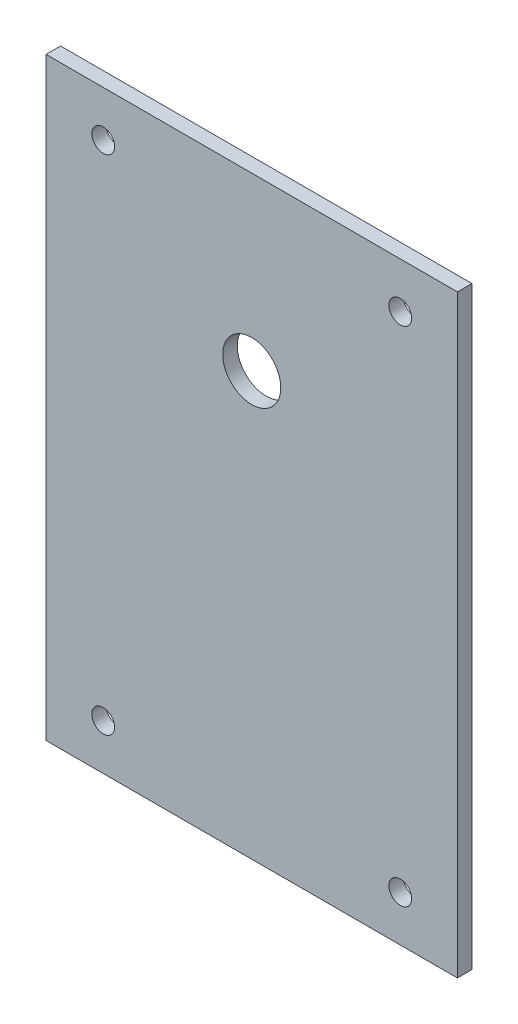
ISO-10303-21;
HEADER;
FILE_DESCRIPTION(('STEP AP214'),'2;1');
FILE_NAME('part.step','',(''),(''),'','','');
FILE_SCHEMA(('AUTOMOTIVE_DESIGN { 1 0 10303 214 1 1 1 1 }'));
ENDSEC;
DATA;
#1=APPLICATION_CONTEXT('core data for automotive mechanical design processes');
#2=APPLICATION_PROTOCOL_DEFINITION('international standard','automotive_design',2000,#1);
#3=PRODUCT_CONTEXT('',#1,'mechanical');
#4=PRODUCT('Part','Part','',(#3));
#5=PRODUCT_RELATED_PRODUCT_CATEGORY('part','',(#4));
#6=PRODUCT_DEFINITION_FORMATION('','',#4);
#7=PRODUCT_DEFINITION_CONTEXT('part definition',#1,'design');
#8=PRODUCT_DEFINITION('design','',#6,#7);
#9=PRODUCT_DEFINITION_SHAPE('','',#8);
#10=(LENGTH_UNIT() NAMED_UNIT(*) SI_UNIT(.MILLI.,.METRE.));
#11=(NAMED_UNIT(*) PLANE_ANGLE_UNIT() SI_UNIT($,.RADIAN.));
#12=(NAMED_UNIT(*) SI_UNIT($,.STERADIAN.) SOLID_ANGLE_UNIT());
#13=UNCERTAINTY_MEASURE_WITH_UNIT(LENGTH_MEASURE(1.E-05),#10,'distance_accuracy_value','');
#14=(GEOMETRIC_REPRESENTATION_CONTEXT(3) GLOBAL_UNCERTAINTY_ASSIGNED_CONTEXT((#13)) GLOBAL_UNIT_ASSIGNED_CONTEXT((#10,
#11,#12)) REPRESENTATION_CONTEXT('',''));
#15=CARTESIAN_POINT('',(0.,0.,0.));
#16=DIRECTION('',(0.,0.,1.));
#17=DIRECTION('',(1.,0.,0.));
#18=AXIS2_PLACEMENT_3D('',#15,#16,#17);
#19=CARTESIAN_POINT('',(-90.,130.,3.175));
#20=DIRECTION('',(1.,0.,0.));
#21=DIRECTION('',(0.,1.,0.));
#22=AXIS2_PLACEMENT_3D('',#19,#20,#21);
#23=PLANE('',#22);
#24=DIRECTION('',(0.,-1.,0.));
#25=VECTOR('',#24,1.);
#26=CARTESIAN_POINT('',(-90.,130.,0.));
#27=LINE('',#26,#25);
#28=CARTESIAN_POINT('',(-90.,130.,0.));
#29=VERTEX_POINT('',#28);
#30=CARTESIAN_POINT('',(-90.,0.,0.));
#31=VERTEX_POINT('',#30);
#32=EDGE_CURVE('E102',#29,#31,#27,.T.);
#33=ORIENTED_EDGE('',*,*,#32,.T.);
#34=DIRECTION('',(0.,0.,-1.));
#35=VECTOR('',#34,1.);
#36=CARTESIAN_POINT('',(-90.,0.,3.175));
#37=LINE('',#36,#35);
#38=CARTESIAN_POINT('',(-90.,0.,3.175));
#39=VERTEX_POINT('',#38);
#40=EDGE_CURVE('E11',#39,#31,#37,.T.);
#41=ORIENTED_EDGE('',*,*,#40,.F.);
#42=DIRECTION('',(0.,-1.,0.));
#43=VECTOR('',#42,1.);
#44=CARTESIAN_POINT('',(-90.,130.,3.175));
#45=LINE('',#44,#43);
#46=CARTESIAN_POINT('',(-90.,130.,3.175));
#47=VERTEX_POINT('',#46);
#48=EDGE_CURVE('E90',#47,#39,#45,.T.);
#49=ORIENTED_EDGE('',*,*,#48,.F.);
#50=DIRECTION('',(0.,0.,-1.));
#51=VECTOR('',#50,1.);
#52=CARTESIAN_POINT('',(-90.,130.,3.175));
#53=LINE('',#52,#51);
#54=EDGE_CURVE('E98',#47,#29,#53,.T.);
#55=ORIENTED_EDGE('',*,*,#54,.T.);
#56=EDGE_LOOP('',(#33,#41,#49,#55));
#57=FACE_BOUND('',#56,.T.);
#58=ADVANCED_FACE('F39',(#57),#23,.F.);
#59=CARTESIAN_POINT('',(-90.,0.,3.175));
#60=DIRECTION('',(0.,1.,0.));
#61=DIRECTION('',(0.,0.,1.));
#62=AXIS2_PLACEMENT_3D('',#59,#60,#61);
#63=PLANE('',#62);
#64=DIRECTION('',(1.,0.,0.));
#65=VECTOR('',#64,1.);
#66=CARTESIAN_POINT('',(-90.,0.,0.));
#67=LINE('',#66,#65);
#68=CARTESIAN_POINT('',(0.,0.,0.));
#69=VERTEX_POINT('',#68);
#70=EDGE_CURVE('E94',#31,#69,#67,.T.);
#71=ORIENTED_EDGE('',*,*,#70,.T.);
#72=DIRECTION('',(0.,0.,-1.));
#73=VECTOR('',#72,1.);
#74=CARTESIAN_POINT('',(0.,0.,3.175));
#75=LINE('',#74,#73);
#76=CARTESIAN_POINT('',(0.,0.,3.175));
#77=VERTEX_POINT('',#76);
#78=EDGE_CURVE('E47',#77,#69,#75,.T.);
#79=ORIENTED_EDGE('',*,*,#78,.F.);
#80=DIRECTION('',(1.,0.,0.));
#81=VECTOR('',#80,1.);
#82=CARTESIAN_POINT('',(-90.,0.,3.175));
#83=LINE('',#82,#81);
#84=EDGE_CURVE('E85',#39,#77,#83,.T.);
#85=ORIENTED_EDGE('',*,*,#84,.F.);
#86=ORIENTED_EDGE('',*,*,#40,.T.);
#87=EDGE_LOOP('',(#71,#79,#85,#86));
#88=FACE_BOUND('',#87,.T.);
#89=ADVANCED_FACE('F93',(#88),#63,.F.);
#90=CARTESIAN_POINT('',(0.,130.,3.175));
#91=DIRECTION('',(-1.,0.,0.));
#92=DIRECTION('',(0.,-1.,0.));
#93=AXIS2_PLACEMENT_3D('',#90,#91,#92);
#94=PLANE('',#93);
#95=DIRECTION('',(0.,1.,0.));
#96=VECTOR('',#95,1.);
#97=CARTESIAN_POINT('',(0.,130.,0.));
#98=LINE('',#97,#96);
#99=CARTESIAN_POINT('',(0.,130.,0.));
#100=VERTEX_POINT('',#99);
#101=EDGE_CURVE('E72',#69,#100,#98,.T.);
#102=ORIENTED_EDGE('',*,*,#101,.T.);
#103=DIRECTION('',(0.,0.,-1.));
#104=VECTOR('',#103,1.);
#105=CARTESIAN_POINT('',(0.,130.,3.175));
#106=LINE('',#105,#104);
#107=CARTESIAN_POINT('',(0.,130.,3.175));
#108=VERTEX_POINT('',#107);
#109=EDGE_CURVE('E95',#108,#100,#106,.T.);
#110=ORIENTED_EDGE('',*,*,#109,.F.);
#111=DIRECTION('',(0.,1.,0.));
#112=VECTOR('',#111,1.);
#113=CARTESIAN_POINT('',(0.,130.,3.175));
#114=LINE('',#113,#112);
#115=EDGE_CURVE('E88',#77,#108,#114,.T.);
#116=ORIENTED_EDGE('',*,*,#115,.F.);
#117=ORIENTED_EDGE('',*,*,#78,.T.);
#118=EDGE_LOOP('',(#102,#110,#116,#117));
#119=FACE_BOUND('',#118,.T.);
#120=ADVANCED_FACE('F96',(#119),#94,.F.);
#121=CARTESIAN_POINT('',(-90.,130.,3.175));
#122=DIRECTION('',(0.,-1.,0.));
#123=DIRECTION('',(0.,0.,-1.));
#124=AXIS2_PLACEMENT_3D('',#121,#122,#123);
#125=PLANE('',#124);
#126=DIRECTION('',(-1.,0.,0.));
#127=VECTOR('',#126,1.);
#128=CARTESIAN_POINT('',(-90.,130.,0.));
#129=LINE('',#128,#127);
#130=EDGE_CURVE('E78',#100,#29,#129,.T.);
#131=ORIENTED_EDGE('',*,*,#130,.T.);
#132=ORIENTED_EDGE('',*,*,#54,.F.);
#133=DIRECTION('',(-1.,0.,0.));
#134=VECTOR('',#133,1.);
#135=CARTESIAN_POINT('',(-90.,130.,3.175));
#136=LINE('',#135,#134);
#137=EDGE_CURVE('E55',#108,#47,#136,.T.);
#138=ORIENTED_EDGE('',*,*,#137,.F.);
#139=ORIENTED_EDGE('',*,*,#109,.T.);
#140=EDGE_LOOP('',(#131,#132,#138,#139));
#141=FACE_BOUND('',#140,.T.);
#142=ADVANCED_FACE('F110',(#141),#125,.F.);
#143=CARTESIAN_POINT('',(0.,0.,3.175));
#144=DIRECTION('',(0.,0.,1.));
#145=DIRECTION('',(1.,0.,0.));
#146=AXIS2_PLACEMENT_3D('',#143,#144,#145);
#147=PLANE('',#146);
#148=CARTESIAN_POINT('',(-45.,92.5,3.175));
#149=DIRECTION('',(0.,0.,1.));
#150=DIRECTION('',(1.,0.,0.));
#151=AXIS2_PLACEMENT_3D('',#148,#149,#150);
#152=CIRCLE('',#151,6.35);
#153=CARTESIAN_POINT('',(-38.65,92.5,3.175));
#154=VERTEX_POINT('',#153);
#155=EDGE_CURVE('E142',#154,#154,#152,.T.);
#156=ORIENTED_EDGE('',*,*,#155,.F.);
#157=EDGE_LOOP('',(#156));
#158=FACE_BOUND('',#157,.T.);
#159=CARTESIAN_POINT('',(-77.5,9.99999999999997,3.175));
#160=DIRECTION('',(0.,0.,-1.));
#161=DIRECTION('',(1.,0.,0.));
#162=AXIS2_PLACEMENT_3D('',#159,#160,#161);
#163=CIRCLE('',#162,2.50000000000001);
#164=CARTESIAN_POINT('',(-75.,9.99999999999997,3.175));
#165=VERTEX_POINT('',#164);
#166=EDGE_CURVE('E131',#165,#165,#163,.T.);
#167=ORIENTED_EDGE('',*,*,#166,.T.);
#168=EDGE_LOOP('',(#167));
#169=FACE_BOUND('',#168,.T.);
#170=CARTESIAN_POINT('',(-12.5,9.99999999999997,3.175));
#171=DIRECTION('',(0.,0.,-1.));
#172=DIRECTION('',(1.,0.,0.));
#173=AXIS2_PLACEMENT_3D('',#170,#171,#172);
#174=CIRCLE('',#173,2.5);
#175=CARTESIAN_POINT('',(-9.99999999999999,9.99999999999997,3.175));
#176=VERTEX_POINT('',#175);
#177=EDGE_CURVE('E132',#176,#176,#174,.T.);
#178=ORIENTED_EDGE('',*,*,#177,.T.);
#179=EDGE_LOOP('',(#178));
#180=FACE_BOUND('',#179,.T.);
#181=CARTESIAN_POINT('',(-77.5,120.,3.175));
#182=DIRECTION('',(0.,0.,1.));
#183=DIRECTION('',(1.,0.,0.));
#184=AXIS2_PLACEMENT_3D('',#181,#182,#183);
#185=CIRCLE('',#184,2.50000000000001);
#186=CARTESIAN_POINT('',(-75.,120.,3.175));
#187=VERTEX_POINT('',#186);
#188=EDGE_CURVE('E119',#187,#187,#185,.T.);
#189=ORIENTED_EDGE('',*,*,#188,.F.);
#190=EDGE_LOOP('',(#189));
#191=FACE_BOUND('',#190,.T.);
#192=CARTESIAN_POINT('',(-12.5,120.,3.175));
#193=DIRECTION('',(0.,0.,1.));
#194=DIRECTION('',(1.,0.,0.));
#195=AXIS2_PLACEMENT_3D('',#192,#193,#194);
#196=CIRCLE('',#195,2.5);
#197=CARTESIAN_POINT('',(-9.99999999999999,120.,3.175));
#198=VERTEX_POINT('',#197);
#199=EDGE_CURVE('E116',#198,#198,#196,.T.);
#200=ORIENTED_EDGE('',*,*,#199,.F.);
#201=EDGE_LOOP('',(#200));
#202=FACE_BOUND('',#201,.T.);
#203=ORIENTED_EDGE('',*,*,#48,.T.);
#204=ORIENTED_EDGE('',*,*,#84,.T.);
#205=ORIENTED_EDGE('',*,*,#115,.T.);
#206=ORIENTED_EDGE('',*,*,#137,.T.);
#207=EDGE_LOOP('',(#203,#204,#205,#206));
#208=FACE_BOUND('',#207,.T.);
#209=ADVANCED_FACE('F86',(#158,#169,#180,#191,#202,#208),#147,.T.);
#210=CARTESIAN_POINT('',(0.,0.,0.));
#211=DIRECTION('',(0.,0.,1.));
#212=DIRECTION('',(1.,0.,0.));
#213=AXIS2_PLACEMENT_3D('',#210,#211,#212);
#214=PLANE('',#213);
#215=CARTESIAN_POINT('',(-45.,92.5,0.));
#216=DIRECTION('',(0.,0.,1.));
#217=DIRECTION('',(1.,0.,0.));
#218=AXIS2_PLACEMENT_3D('',#215,#216,#217);
#219=CIRCLE('',#218,6.35);
#220=CARTESIAN_POINT('',(-38.65,92.5,0.));
#221=VERTEX_POINT('',#220);
#222=EDGE_CURVE('E135',#221,#221,#219,.F.);
#223=ORIENTED_EDGE('',*,*,#222,.F.);
#224=EDGE_LOOP('',(#223));
#225=FACE_BOUND('',#224,.T.);
#226=CARTESIAN_POINT('',(-77.5,9.99999999999997,0.));
#227=DIRECTION('',(0.,0.,1.));
#228=DIRECTION('',(1.,0.,0.));
#229=AXIS2_PLACEMENT_3D('',#226,#227,#228);
#230=CIRCLE('',#229,2.50000000000001);
#231=CARTESIAN_POINT('',(-75.,9.99999999999997,0.));
#232=VERTEX_POINT('',#231);
#233=EDGE_CURVE('E123',#232,#232,#230,.T.);
#234=ORIENTED_EDGE('',*,*,#233,.T.);
#235=EDGE_LOOP('',(#234));
#236=FACE_BOUND('',#235,.T.);
#237=CARTESIAN_POINT('',(-12.5,9.99999999999997,0.));
#238=DIRECTION('',(0.,0.,1.));
#239=DIRECTION('',(1.,0.,0.));
#240=AXIS2_PLACEMENT_3D('',#237,#238,#239);
#241=CIRCLE('',#240,2.5);
#242=CARTESIAN_POINT('',(-9.99999999999999,9.99999999999997,0.));
#243=VERTEX_POINT('',#242);
#244=EDGE_CURVE('E128',#243,#243,#241,.T.);
#245=ORIENTED_EDGE('',*,*,#244,.T.);
#246=EDGE_LOOP('',(#245));
#247=FACE_BOUND('',#246,.T.);
#248=CARTESIAN_POINT('',(-77.5,120.,0.));
#249=DIRECTION('',(0.,0.,1.));
#250=DIRECTION('',(1.,0.,0.));
#251=AXIS2_PLACEMENT_3D('',#248,#249,#250);
#252=CIRCLE('',#251,2.50000000000001);
#253=CARTESIAN_POINT('',(-75.,120.,0.));
#254=VERTEX_POINT('',#253);
#255=EDGE_CURVE('E105',#254,#254,#252,.F.);
#256=ORIENTED_EDGE('',*,*,#255,.F.);
#257=EDGE_LOOP('',(#256));
#258=FACE_BOUND('',#257,.T.);
#259=CARTESIAN_POINT('',(-12.5,120.,0.));
#260=DIRECTION('',(0.,0.,1.));
#261=DIRECTION('',(1.,0.,0.));
#262=AXIS2_PLACEMENT_3D('',#259,#260,#261);
#263=CIRCLE('',#262,2.5);
#264=CARTESIAN_POINT('',(-9.99999999999999,120.,0.));
#265=VERTEX_POINT('',#264);
#266=EDGE_CURVE('E120',#265,#265,#263,.F.);
#267=ORIENTED_EDGE('',*,*,#266,.F.);
#268=EDGE_LOOP('',(#267));
#269=FACE_BOUND('',#268,.T.);
#270=ORIENTED_EDGE('',*,*,#32,.F.);
#271=ORIENTED_EDGE('',*,*,#130,.F.);
#272=ORIENTED_EDGE('',*,*,#101,.F.);
#273=ORIENTED_EDGE('',*,*,#70,.F.);
#274=EDGE_LOOP('',(#270,#271,#272,#273));
#275=FACE_BOUND('',#274,.T.);
#276=ADVANCED_FACE('F113',(#225,#236,#247,#258,#269,#275),#214,.F.);
#277=CARTESIAN_POINT('',(-12.5,120.,-7.07106781186552));
#278=DIRECTION('',(0.,0.,1.));
#279=DIRECTION('',(1.,0.,0.));
#280=AXIS2_PLACEMENT_3D('',#277,#278,#279);
#281=CYLINDRICAL_SURFACE('',#280,2.5);
#282=ORIENTED_EDGE('',*,*,#266,.T.);
#283=EDGE_LOOP('',(#282));
#284=FACE_BOUND('',#283,.T.);
#285=ORIENTED_EDGE('',*,*,#199,.T.);
#286=EDGE_LOOP('',(#285));
#287=FACE_BOUND('',#286,.T.);
#288=ADVANCED_FACE('F159',(#284,#287),#281,.F.);
#289=CARTESIAN_POINT('',(-77.5,120.,-7.07106781186552));
#290=DIRECTION('',(0.,0.,1.));
#291=DIRECTION('',(1.,0.,0.));
#292=AXIS2_PLACEMENT_3D('',#289,#290,#291);
#293=CYLINDRICAL_SURFACE('',#292,2.50000000000001);
#294=ORIENTED_EDGE('',*,*,#255,.T.);
#295=EDGE_LOOP('',(#294));
#296=FACE_BOUND('',#295,.T.);
#297=ORIENTED_EDGE('',*,*,#188,.T.);
#298=EDGE_LOOP('',(#297));
#299=FACE_BOUND('',#298,.T.);
#300=ADVANCED_FACE('F161',(#296,#299),#293,.F.);
#301=CARTESIAN_POINT('',(-12.5,9.99999999999997,-7.07106781186551));
#302=DIRECTION('',(0.,0.,1.));
#303=DIRECTION('',(1.,0.,0.));
#304=AXIS2_PLACEMENT_3D('',#301,#302,#303);
#305=CYLINDRICAL_SURFACE('',#304,2.5);
#306=ORIENTED_EDGE('',*,*,#244,.F.);
#307=EDGE_LOOP('',(#306));
#308=FACE_BOUND('',#307,.T.);
#309=ORIENTED_EDGE('',*,*,#177,.F.);
#310=EDGE_LOOP('',(#309));
#311=FACE_BOUND('',#310,.T.);
#312=ADVANCED_FACE('F168',(#308,#311),#305,.F.);
#313=CARTESIAN_POINT('',(-77.5,9.99999999999997,-7.07106781186551));
#314=DIRECTION('',(0.,0.,1.));
#315=DIRECTION('',(1.,0.,0.));
#316=AXIS2_PLACEMENT_3D('',#313,#314,#315);
#317=CYLINDRICAL_SURFACE('',#316,2.50000000000001);
#318=ORIENTED_EDGE('',*,*,#233,.F.);
#319=EDGE_LOOP('',(#318));
#320=FACE_BOUND('',#319,.T.);
#321=ORIENTED_EDGE('',*,*,#166,.F.);
#322=EDGE_LOOP('',(#321));
#323=FACE_BOUND('',#322,.T.);
#324=ADVANCED_FACE('F206',(#320,#323),#317,.F.);
#325=CARTESIAN_POINT('',(-45.,92.5,-17.9605122421383));
#326=DIRECTION('',(0.,0.,1.));
#327=DIRECTION('',(1.,0.,0.));
#328=AXIS2_PLACEMENT_3D('',#325,#326,#327);
#329=CYLINDRICAL_SURFACE('',#328,6.35);
#330=ORIENTED_EDGE('',*,*,#222,.T.);
#331=EDGE_LOOP('',(#330));
#332=FACE_BOUND('',#331,.T.);
#333=ORIENTED_EDGE('',*,*,#155,.T.);
#334=EDGE_LOOP('',(#333));
#335=FACE_BOUND('',#334,.T.);
#336=ADVANCED_FACE('F146',(#332,#335),#329,.F.);
#337=CLOSED_SHELL('',(#58,#89,#120,#142,#209,#276,#288,#300,#312,#324,#336));
#338=MANIFOLD_SOLID_BREP('B2',#337);
#339=ADVANCED_BREP_SHAPE_REPRESENTATION('',(#18,#338),#14);
#340=SHAPE_DEFINITION_REPRESENTATION(#9,#339);
ENDSEC;
END-ISO-10303-21;
